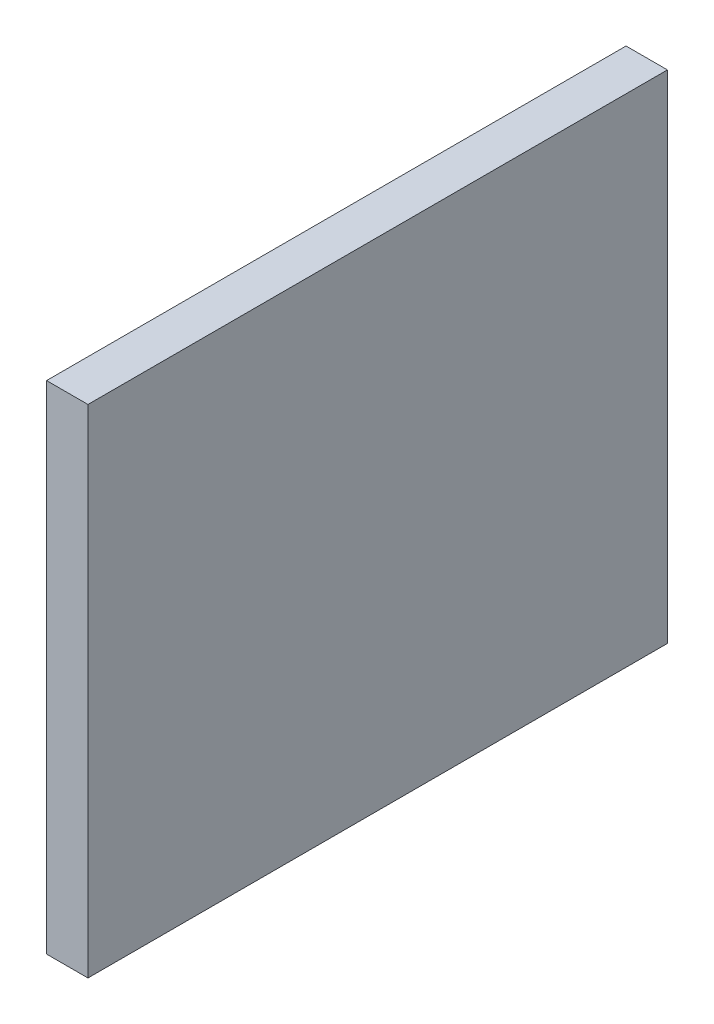
ISO-10303-21;
HEADER;
FILE_DESCRIPTION(('STEP AP214'),'2;1');
FILE_NAME('part.step','',(''),(''),'','','');
FILE_SCHEMA(('AUTOMOTIVE_DESIGN { 1 0 10303 214 1 1 1 1 }'));
ENDSEC;
DATA;
#1=APPLICATION_CONTEXT('core data for automotive mechanical design processes');
#2=APPLICATION_PROTOCOL_DEFINITION('international standard','automotive_design',2000,#1);
#3=PRODUCT_CONTEXT('',#1,'mechanical');
#4=PRODUCT('Part','Part','',(#3));
#5=PRODUCT_RELATED_PRODUCT_CATEGORY('part','',(#4));
#6=PRODUCT_DEFINITION_FORMATION('','',#4);
#7=PRODUCT_DEFINITION_CONTEXT('part definition',#1,'design');
#8=PRODUCT_DEFINITION('design','',#6,#7);
#9=PRODUCT_DEFINITION_SHAPE('','',#8);
#10=(LENGTH_UNIT() NAMED_UNIT(*) SI_UNIT(.MILLI.,.METRE.));
#11=(NAMED_UNIT(*) PLANE_ANGLE_UNIT() SI_UNIT($,.RADIAN.));
#12=(NAMED_UNIT(*) SI_UNIT($,.STERADIAN.) SOLID_ANGLE_UNIT());
#13=UNCERTAINTY_MEASURE_WITH_UNIT(LENGTH_MEASURE(1.E-05),#10,'distance_accuracy_value','');
#14=(GEOMETRIC_REPRESENTATION_CONTEXT(3) GLOBAL_UNCERTAINTY_ASSIGNED_CONTEXT((#13)) GLOBAL_UNIT_ASSIGNED_CONTEXT((#10,
#11,#12)) REPRESENTATION_CONTEXT('',''));
#15=CARTESIAN_POINT('',(0.,0.,0.));
#16=DIRECTION('',(0.,0.,1.));
#17=DIRECTION('',(1.,0.,0.));
#18=AXIS2_PLACEMENT_3D('',#15,#16,#17);
#19=CARTESIAN_POINT('',(5.,0.,0.));
#20=DIRECTION('',(0.,0.,-1.));
#21=DIRECTION('',(-1.,0.,0.));
#22=AXIS2_PLACEMENT_3D('',#19,#20,#21);
#23=PLANE('',#22);
#24=DIRECTION('',(0.,-1.,0.));
#25=VECTOR('',#24,1.);
#26=CARTESIAN_POINT('',(0.,0.,0.));
#27=LINE('',#26,#25);
#28=CARTESIAN_POINT('',(0.,0.,0.));
#29=VERTEX_POINT('',#28);
#30=CARTESIAN_POINT('',(0.,-60.,0.));
#31=VERTEX_POINT('',#30);
#32=EDGE_CURVE('E107',#29,#31,#27,.T.);
#33=ORIENTED_EDGE('',*,*,#32,.T.);
#34=DIRECTION('',(-1.,0.,0.));
#35=VECTOR('',#34,1.);
#36=CARTESIAN_POINT('',(5.,-60.,0.));
#37=LINE('',#36,#35);
#38=CARTESIAN_POINT('',(5.,-60.,0.));
#39=VERTEX_POINT('',#38);
#40=EDGE_CURVE('E11',#39,#31,#37,.T.);
#41=ORIENTED_EDGE('',*,*,#40,.F.);
#42=DIRECTION('',(0.,-1.,0.));
#43=VECTOR('',#42,1.);
#44=CARTESIAN_POINT('',(5.,0.,0.));
#45=LINE('',#44,#43);
#46=CARTESIAN_POINT('',(5.,0.,0.));
#47=VERTEX_POINT('',#46);
#48=EDGE_CURVE('E91',#47,#39,#45,.T.);
#49=ORIENTED_EDGE('',*,*,#48,.F.);
#50=DIRECTION('',(-1.,0.,0.));
#51=VECTOR('',#50,1.);
#52=CARTESIAN_POINT('',(5.,0.,0.));
#53=LINE('',#52,#51);
#54=EDGE_CURVE('E103',#47,#29,#53,.T.);
#55=ORIENTED_EDGE('',*,*,#54,.T.);
#56=EDGE_LOOP('',(#33,#41,#49,#55));
#57=FACE_BOUND('',#56,.T.);
#58=ADVANCED_FACE('F39',(#57),#23,.F.);
#59=CARTESIAN_POINT('',(5.,-60.,0.));
#60=DIRECTION('',(0.,1.,0.));
#61=DIRECTION('',(0.,0.,1.));
#62=AXIS2_PLACEMENT_3D('',#59,#60,#61);
#63=PLANE('',#62);
#64=DIRECTION('',(0.,0.,-1.));
#65=VECTOR('',#64,1.);
#66=CARTESIAN_POINT('',(0.,-60.,0.));
#67=LINE('',#66,#65);
#68=CARTESIAN_POINT('',(0.,-60.,-70.));
#69=VERTEX_POINT('',#68);
#70=EDGE_CURVE('E96',#31,#69,#67,.T.);
#71=ORIENTED_EDGE('',*,*,#70,.T.);
#72=DIRECTION('',(-1.,0.,0.));
#73=VECTOR('',#72,1.);
#74=CARTESIAN_POINT('',(5.,-60.,-70.));
#75=LINE('',#74,#73);
#76=CARTESIAN_POINT('',(5.,-60.,-70.));
#77=VERTEX_POINT('',#76);
#78=EDGE_CURVE('E48',#77,#69,#75,.T.);
#79=ORIENTED_EDGE('',*,*,#78,.F.);
#80=DIRECTION('',(0.,0.,-1.));
#81=VECTOR('',#80,1.);
#82=CARTESIAN_POINT('',(5.,-60.,0.));
#83=LINE('',#82,#81);
#84=EDGE_CURVE('E86',#39,#77,#83,.T.);
#85=ORIENTED_EDGE('',*,*,#84,.F.);
#86=ORIENTED_EDGE('',*,*,#40,.T.);
#87=EDGE_LOOP('',(#71,#79,#85,#86));
#88=FACE_BOUND('',#87,.T.);
#89=ADVANCED_FACE('F95',(#88),#63,.F.);
#90=CARTESIAN_POINT('',(5.,0.,-70.));
#91=DIRECTION('',(0.,0.,1.));
#92=DIRECTION('',(0.,-1.,0.));
#93=AXIS2_PLACEMENT_3D('',#90,#91,#92);
#94=PLANE('',#93);
#95=DIRECTION('',(0.,1.,0.));
#96=VECTOR('',#95,1.);
#97=CARTESIAN_POINT('',(0.,0.,-70.));
#98=LINE('',#97,#96);
#99=CARTESIAN_POINT('',(0.,0.,-70.));
#100=VERTEX_POINT('',#99);
#101=EDGE_CURVE('E73',#69,#100,#98,.T.);
#102=ORIENTED_EDGE('',*,*,#101,.T.);
#103=DIRECTION('',(-1.,0.,0.));
#104=VECTOR('',#103,1.);
#105=CARTESIAN_POINT('',(5.,0.,-70.));
#106=LINE('',#105,#104);
#107=CARTESIAN_POINT('',(5.,0.,-70.));
#108=VERTEX_POINT('',#107);
#109=EDGE_CURVE('E98',#108,#100,#106,.T.);
#110=ORIENTED_EDGE('',*,*,#109,.F.);
#111=DIRECTION('',(0.,1.,0.));
#112=VECTOR('',#111,1.);
#113=CARTESIAN_POINT('',(5.,0.,-70.));
#114=LINE('',#113,#112);
#115=EDGE_CURVE('E89',#77,#108,#114,.T.);
#116=ORIENTED_EDGE('',*,*,#115,.F.);
#117=ORIENTED_EDGE('',*,*,#78,.T.);
#118=EDGE_LOOP('',(#102,#110,#116,#117));
#119=FACE_BOUND('',#118,.T.);
#120=ADVANCED_FACE('F99',(#119),#94,.F.);
#121=CARTESIAN_POINT('',(5.,0.,0.));
#122=DIRECTION('',(0.,-1.,0.));
#123=DIRECTION('',(0.,0.,-1.));
#124=AXIS2_PLACEMENT_3D('',#121,#122,#123);
#125=PLANE('',#124);
#126=DIRECTION('',(0.,0.,1.));
#127=VECTOR('',#126,1.);
#128=CARTESIAN_POINT('',(0.,0.,0.));
#129=LINE('',#128,#127);
#130=EDGE_CURVE('E79',#100,#29,#129,.T.);
#131=ORIENTED_EDGE('',*,*,#130,.T.);
#132=ORIENTED_EDGE('',*,*,#54,.F.);
#133=DIRECTION('',(0.,0.,1.));
#134=VECTOR('',#133,1.);
#135=CARTESIAN_POINT('',(5.,0.,0.));
#136=LINE('',#135,#134);
#137=EDGE_CURVE('E56',#108,#47,#136,.T.);
#138=ORIENTED_EDGE('',*,*,#137,.F.);
#139=ORIENTED_EDGE('',*,*,#109,.T.);
#140=EDGE_LOOP('',(#131,#132,#138,#139));
#141=FACE_BOUND('',#140,.T.);
#142=ADVANCED_FACE('F120',(#141),#125,.F.);
#143=CARTESIAN_POINT('',(5.,0.,0.));
#144=DIRECTION('',(1.,0.,0.));
#145=DIRECTION('',(0.,0.,-1.));
#146=AXIS2_PLACEMENT_3D('',#143,#144,#145);
#147=PLANE('',#146);
#148=ORIENTED_EDGE('',*,*,#48,.T.);
#149=ORIENTED_EDGE('',*,*,#84,.T.);
#150=ORIENTED_EDGE('',*,*,#115,.T.);
#151=ORIENTED_EDGE('',*,*,#137,.T.);
#152=EDGE_LOOP('',(#148,#149,#150,#151));
#153=FACE_BOUND('',#152,.T.);
#154=ADVANCED_FACE('F87',(#153),#147,.T.);
#155=CARTESIAN_POINT('',(0.,0.,0.));
#156=DIRECTION('',(1.,0.,0.));
#157=DIRECTION('',(0.,0.,-1.));
#158=AXIS2_PLACEMENT_3D('',#155,#156,#157);
#159=PLANE('',#158);
#160=ORIENTED_EDGE('',*,*,#32,.F.);
#161=ORIENTED_EDGE('',*,*,#130,.F.);
#162=ORIENTED_EDGE('',*,*,#101,.F.);
#163=ORIENTED_EDGE('',*,*,#70,.F.);
#164=EDGE_LOOP('',(#160,#161,#162,#163));
#165=FACE_BOUND('',#164,.T.);
#166=ADVANCED_FACE('F123',(#165),#159,.F.);
#167=CLOSED_SHELL('',(#58,#89,#120,#142,#154,#166));
#168=MANIFOLD_SOLID_BREP('B2',#167);
#169=ADVANCED_BREP_SHAPE_REPRESENTATION('',(#18,#168),#14);
#170=SHAPE_DEFINITION_REPRESENTATION(#9,#169);
ENDSEC;
END-ISO-10303-21;
